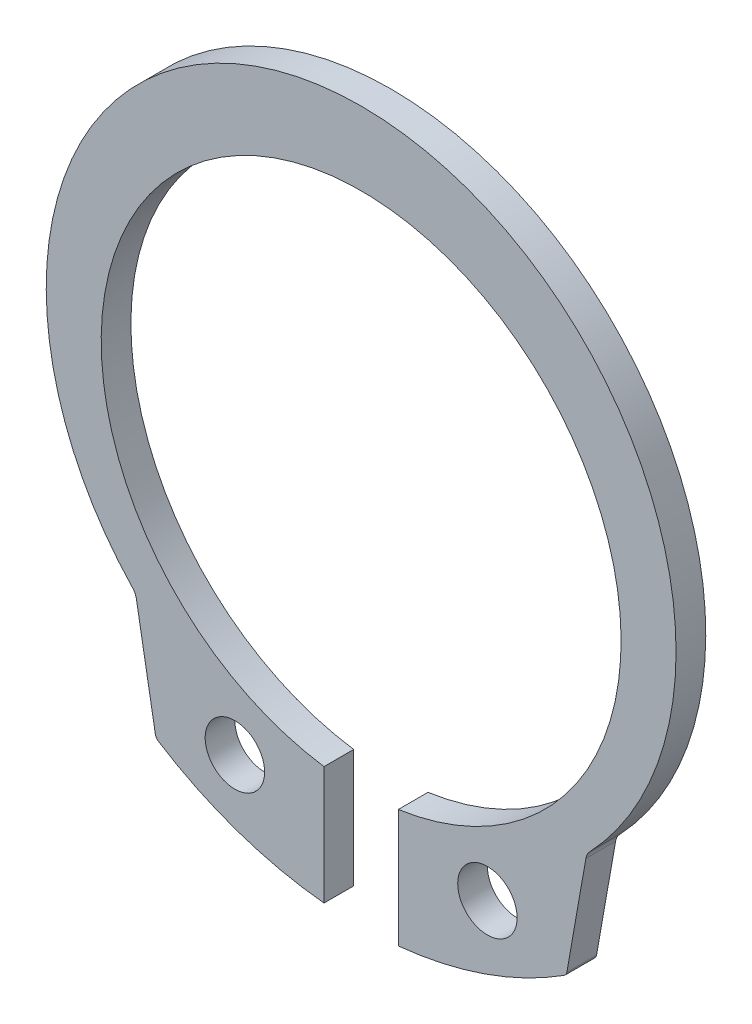
ISO-10303-21;
HEADER;
FILE_DESCRIPTION(('STEP AP214'),'2;1');
FILE_NAME('part.step','',(''),(''),'','','');
FILE_SCHEMA(('AUTOMOTIVE_DESIGN { 1 0 10303 214 1 1 1 1 }'));
ENDSEC;
DATA;
#1=APPLICATION_CONTEXT('core data for automotive mechanical design processes');
#2=APPLICATION_PROTOCOL_DEFINITION('international standard','automotive_design',2000,#1);
#3=PRODUCT_CONTEXT('',#1,'mechanical');
#4=PRODUCT('Part','Part','',(#3));
#5=PRODUCT_RELATED_PRODUCT_CATEGORY('part','',(#4));
#6=PRODUCT_DEFINITION_FORMATION('','',#4);
#7=PRODUCT_DEFINITION_CONTEXT('part definition',#1,'design');
#8=PRODUCT_DEFINITION('design','',#6,#7);
#9=PRODUCT_DEFINITION_SHAPE('','',#8);
#10=(LENGTH_UNIT() NAMED_UNIT(*) SI_UNIT(.MILLI.,.METRE.));
#11=(NAMED_UNIT(*) PLANE_ANGLE_UNIT() SI_UNIT($,.RADIAN.));
#12=(NAMED_UNIT(*) SI_UNIT($,.STERADIAN.) SOLID_ANGLE_UNIT());
#13=UNCERTAINTY_MEASURE_WITH_UNIT(LENGTH_MEASURE(1.E-05),#10,'distance_accuracy_value','');
#14=(GEOMETRIC_REPRESENTATION_CONTEXT(3) GLOBAL_UNCERTAINTY_ASSIGNED_CONTEXT((#13)) GLOBAL_UNIT_ASSIGNED_CONTEXT((#10,
#11,#12)) REPRESENTATION_CONTEXT('',''));
#15=CARTESIAN_POINT('',(0.,0.,0.));
#16=DIRECTION('',(0.,0.,1.));
#17=DIRECTION('',(1.,0.,0.));
#18=AXIS2_PLACEMENT_3D('',#15,#16,#17);
#19=CARTESIAN_POINT('',(0.,-0.62,-1.));
#20=DIRECTION('',(0.,0.,1.));
#21=DIRECTION('',(1.,0.,0.));
#22=AXIS2_PLACEMENT_3D('',#19,#20,#21);
#23=CYLINDRICAL_SURFACE('',#22,12.7);
#24=CARTESIAN_POINT('',(0.,-0.62,-1.));
#25=DIRECTION('',(0.,0.,1.));
#26=DIRECTION('',(-1.,0.,0.));
#27=AXIS2_PLACEMENT_3D('',#24,#25,#26);
#28=CIRCLE('',#27,12.7);
#29=CARTESIAN_POINT('',(1.25,-13.2583345421776,-1.));
#30=VERTEX_POINT('',#29);
#31=CARTESIAN_POINT('',(6.83381170142193,-11.3246259920424,-1.));
#32=VERTEX_POINT('',#31);
#33=EDGE_CURVE('E192',#30,#32,#28,.T.);
#34=ORIENTED_EDGE('',*,*,#33,.T.);
#35=DIRECTION('',(0.,0.,1.));
#36=VECTOR('',#35,1.);
#37=CARTESIAN_POINT('',(6.83381170142193,-11.3246259920423,-1.));
#38=LINE('',#37,#36);
#39=CARTESIAN_POINT('',(6.83381170142193,-11.3246259920424,0.));
#40=VERTEX_POINT('',#39);
#41=EDGE_CURVE('E214',#32,#40,#38,.T.);
#42=ORIENTED_EDGE('',*,*,#41,.T.);
#43=CARTESIAN_POINT('',(0.,-0.62,0.));
#44=DIRECTION('',(0.,0.,1.));
#45=DIRECTION('',(-1.,0.,0.));
#46=AXIS2_PLACEMENT_3D('',#43,#44,#45);
#47=CIRCLE('',#46,12.7);
#48=CARTESIAN_POINT('',(1.25,-13.2583345421776,0.));
#49=VERTEX_POINT('',#48);
#50=EDGE_CURVE('E169',#49,#40,#47,.T.);
#51=ORIENTED_EDGE('',*,*,#50,.F.);
#52=DIRECTION('',(0.,0.,1.));
#53=VECTOR('',#52,1.);
#54=CARTESIAN_POINT('',(1.25,-13.2583345421776,-1.));
#55=LINE('',#54,#53);
#56=EDGE_CURVE('E193',#30,#49,#55,.T.);
#57=ORIENTED_EDGE('',*,*,#56,.F.);
#58=EDGE_LOOP('',(#34,#42,#51,#57));
#59=FACE_BOUND('',#58,.T.);
#60=ADVANCED_FACE('F38',(#59),#23,.T.);
#61=CARTESIAN_POINT('',(1.25,-9.28025403784439,-1.));
#62=DIRECTION('',(-1.,0.,0.));
#63=DIRECTION('',(0.,-1.,0.));
#64=AXIS2_PLACEMENT_3D('',#61,#62,#63);
#65=PLANE('',#64);
#66=DIRECTION('',(0.,-1.,0.));
#67=VECTOR('',#66,1.);
#68=CARTESIAN_POINT('',(1.25,-9.28025403784439,0.));
#69=LINE('',#68,#67);
#70=CARTESIAN_POINT('',(1.25,-9.28025403784439,0.));
#71=VERTEX_POINT('',#70);
#72=EDGE_CURVE('E189',#71,#49,#69,.T.);
#73=ORIENTED_EDGE('',*,*,#72,.F.);
#74=DIRECTION('',(0.,0.,1.));
#75=VECTOR('',#74,1.);
#76=CARTESIAN_POINT('',(1.25,-9.28025403784439,-1.));
#77=LINE('',#76,#75);
#78=CARTESIAN_POINT('',(1.25,-9.28025403784439,-1.));
#79=VERTEX_POINT('',#78);
#80=EDGE_CURVE('E196',#79,#71,#77,.T.);
#81=ORIENTED_EDGE('',*,*,#80,.F.);
#82=DIRECTION('',(0.,-1.,0.));
#83=VECTOR('',#82,1.);
#84=CARTESIAN_POINT('',(1.25,-9.28025403784439,-1.));
#85=LINE('',#84,#83);
#86=EDGE_CURVE('E156',#79,#30,#85,.T.);
#87=ORIENTED_EDGE('',*,*,#86,.T.);
#88=ORIENTED_EDGE('',*,*,#56,.T.);
#89=EDGE_LOOP('',(#73,#81,#87,#88));
#90=FACE_BOUND('',#89,.T.);
#91=ADVANCED_FACE('F296',(#90),#65,.T.);
#92=CARTESIAN_POINT('',(0.,-0.62,-1.));
#93=DIRECTION('',(0.,0.,1.));
#94=DIRECTION('',(1.,0.,0.));
#95=AXIS2_PLACEMENT_3D('',#92,#93,#94);
#96=CYLINDRICAL_SURFACE('',#95,8.75);
#97=CARTESIAN_POINT('',(0.,-0.62,0.));
#98=DIRECTION('',(0.,0.,-1.));
#99=DIRECTION('',(1.,0.,0.));
#100=AXIS2_PLACEMENT_3D('',#97,#98,#99);
#101=CIRCLE('',#100,8.75);
#102=CARTESIAN_POINT('',(-1.25000000000001,-9.28025403784439,0.));
#103=VERTEX_POINT('',#102);
#104=EDGE_CURVE('E186',#103,#71,#101,.T.);
#105=ORIENTED_EDGE('',*,*,#104,.F.);
#106=DIRECTION('',(0.,0.,1.));
#107=VECTOR('',#106,1.);
#108=CARTESIAN_POINT('',(-1.25000000000001,-9.28025403784439,-1.));
#109=LINE('',#108,#107);
#110=CARTESIAN_POINT('',(-1.25000000000001,-9.28025403784439,-1.));
#111=VERTEX_POINT('',#110);
#112=EDGE_CURVE('E155',#111,#103,#109,.T.);
#113=ORIENTED_EDGE('',*,*,#112,.F.);
#114=CARTESIAN_POINT('',(0.,-0.62,-1.));
#115=DIRECTION('',(0.,0.,-1.));
#116=DIRECTION('',(1.,0.,0.));
#117=AXIS2_PLACEMENT_3D('',#114,#115,#116);
#118=CIRCLE('',#117,8.75);
#119=EDGE_CURVE('E162',#111,#79,#118,.T.);
#120=ORIENTED_EDGE('',*,*,#119,.T.);
#121=ORIENTED_EDGE('',*,*,#80,.T.);
#122=EDGE_LOOP('',(#105,#113,#120,#121));
#123=FACE_BOUND('',#122,.T.);
#124=ADVANCED_FACE('F299',(#123),#96,.F.);
#125=CARTESIAN_POINT('',(-1.25,-9.28025403784439,-1.));
#126=DIRECTION('',(1.,0.,0.));
#127=DIRECTION('',(0.,1.,0.));
#128=AXIS2_PLACEMENT_3D('',#125,#126,#127);
#129=PLANE('',#128);
#130=DIRECTION('',(0.,1.,0.));
#131=VECTOR('',#130,1.);
#132=CARTESIAN_POINT('',(-1.25,-9.28025403784439,0.));
#133=LINE('',#132,#131);
#134=CARTESIAN_POINT('',(-1.25,-13.2583345421776,0.));
#135=VERTEX_POINT('',#134);
#136=EDGE_CURVE('E154',#135,#103,#133,.T.);
#137=ORIENTED_EDGE('',*,*,#136,.F.);
#138=DIRECTION('',(0.,0.,1.));
#139=VECTOR('',#138,1.);
#140=CARTESIAN_POINT('',(-1.25,-13.2583345421776,-1.));
#141=LINE('',#140,#139);
#142=CARTESIAN_POINT('',(-1.25,-13.2583345421776,-1.));
#143=VERTEX_POINT('',#142);
#144=EDGE_CURVE('E138',#143,#135,#141,.T.);
#145=ORIENTED_EDGE('',*,*,#144,.F.);
#146=DIRECTION('',(0.,1.,0.));
#147=VECTOR('',#146,1.);
#148=CARTESIAN_POINT('',(-1.25,-9.28025403784439,-1.));
#149=LINE('',#148,#147);
#150=EDGE_CURVE('E147',#143,#111,#149,.T.);
#151=ORIENTED_EDGE('',*,*,#150,.T.);
#152=ORIENTED_EDGE('',*,*,#112,.T.);
#153=EDGE_LOOP('',(#137,#145,#151,#152));
#154=FACE_BOUND('',#153,.T.);
#155=ADVANCED_FACE('F152',(#154),#129,.T.);
#156=CARTESIAN_POINT('',(0.,-0.62,-1.));
#157=DIRECTION('',(0.,0.,1.));
#158=DIRECTION('',(1.,0.,0.));
#159=AXIS2_PLACEMENT_3D('',#156,#157,#158);
#160=CYLINDRICAL_SURFACE('',#159,12.7);
#161=CARTESIAN_POINT('',(0.,-0.62,0.));
#162=DIRECTION('',(0.,0.,1.));
#163=DIRECTION('',(1.,0.,0.));
#164=AXIS2_PLACEMENT_3D('',#161,#162,#163);
#165=CIRCLE('',#164,12.7);
#166=CARTESIAN_POINT('',(-6.83381170142193,-11.3246259920424,0.));
#167=VERTEX_POINT('',#166);
#168=EDGE_CURVE('E182',#167,#135,#165,.T.);
#169=ORIENTED_EDGE('',*,*,#168,.F.);
#170=DIRECTION('',(0.,0.,1.));
#171=VECTOR('',#170,1.);
#172=CARTESIAN_POINT('',(-6.83381170142193,-11.3246259920423,-1.));
#173=LINE('',#172,#171);
#174=CARTESIAN_POINT('',(-6.83381170142193,-11.3246259920424,-1.));
#175=VERTEX_POINT('',#174);
#176=EDGE_CURVE('E141',#167,#175,#173,.F.);
#177=ORIENTED_EDGE('',*,*,#176,.T.);
#178=CARTESIAN_POINT('',(0.,-0.62,-1.));
#179=DIRECTION('',(0.,0.,1.));
#180=DIRECTION('',(1.,0.,0.));
#181=AXIS2_PLACEMENT_3D('',#178,#179,#180);
#182=CIRCLE('',#181,12.7);
#183=EDGE_CURVE('E134',#175,#143,#182,.T.);
#184=ORIENTED_EDGE('',*,*,#183,.T.);
#185=ORIENTED_EDGE('',*,*,#144,.T.);
#186=EDGE_LOOP('',(#169,#177,#184,#185));
#187=FACE_BOUND('',#186,.T.);
#188=ADVANCED_FACE('F137',(#187),#160,.T.);
#189=CARTESIAN_POINT('',(-7.59203552672474,-7.3973641630617,-1.));
#190=DIRECTION('',(-0.984807753012208,-0.173648177666931,0.));
#191=DIRECTION('',(0.173648177666931,-0.984807753012208,0.));
#192=AXIS2_PLACEMENT_3D('',#189,#190,#191);
#193=PLANE('',#192);
#194=DIRECTION('',(0.173648177666931,-0.984807753012208,0.));
#195=VECTOR('',#194,1.);
#196=CARTESIAN_POINT('',(-7.59203552672474,-7.3973641630617,0.));
#197=LINE('',#196,#195);
#198=CARTESIAN_POINT('',(-7.56561540993803,-7.5472000910663,0.));
#199=VERTEX_POINT('',#198);
#200=CARTESIAN_POINT('',(-6.92315417011222,-11.1907788402995,0.));
#201=VERTEX_POINT('',#200);
#202=EDGE_CURVE('E179',#199,#201,#197,.T.);
#203=ORIENTED_EDGE('',*,*,#202,.F.);
#204=DIRECTION('',(0.,0.,-1.));
#205=VECTOR('',#204,1.);
#206=CARTESIAN_POINT('',(-7.56561540993803,-7.5472000910663,-1.));
#207=LINE('',#206,#205);
#208=CARTESIAN_POINT('',(-7.56561540993803,-7.5472000910663,-1.));
#209=VERTEX_POINT('',#208);
#210=EDGE_CURVE('E65',#199,#209,#207,.T.);
#211=ORIENTED_EDGE('',*,*,#210,.T.);
#212=DIRECTION('',(0.173648177666931,-0.984807753012208,0.));
#213=VECTOR('',#212,1.);
#214=CARTESIAN_POINT('',(-7.59203552672474,-7.3973641630617,-1.));
#215=LINE('',#214,#213);
#216=CARTESIAN_POINT('',(-6.92315417011222,-11.1907788402995,-1.));
#217=VERTEX_POINT('',#216);
#218=EDGE_CURVE('E148',#209,#217,#215,.T.);
#219=ORIENTED_EDGE('',*,*,#218,.T.);
#220=DIRECTION('',(0.,0.,1.));
#221=VECTOR('',#220,1.);
#222=CARTESIAN_POINT('',(-6.92315417011222,-11.1907788402995,-1.));
#223=LINE('',#222,#221);
#224=EDGE_CURVE('E195',#217,#201,#223,.T.);
#225=ORIENTED_EDGE('',*,*,#224,.T.);
#226=EDGE_LOOP('',(#203,#211,#219,#225));
#227=FACE_BOUND('',#226,.T.);
#228=ADVANCED_FACE('F365',(#227),#193,.T.);
#229=CARTESIAN_POINT('',(0.,0.,-1.));
#230=DIRECTION('',(0.,0.,1.));
#231=DIRECTION('',(1.,0.,0.));
#232=AXIS2_PLACEMENT_3D('',#229,#230,#231);
#233=CYLINDRICAL_SURFACE('',#232,10.6);
#234=CARTESIAN_POINT('',(0.,0.,0.));
#235=DIRECTION('',(0.,0.,1.));
#236=DIRECTION('',(1.,0.,0.));
#237=AXIS2_PLACEMENT_3D('',#234,#235,#236);
#238=CIRCLE('',#237,10.6);
#239=CARTESIAN_POINT('',(7.69504544471242,-7.29014921684122,0.));
#240=VERTEX_POINT('',#239);
#241=CARTESIAN_POINT('',(-7.69504544471242,-7.29014921684122,0.));
#242=VERTEX_POINT('',#241);
#243=EDGE_CURVE('E176',#240,#242,#238,.T.);
#244=ORIENTED_EDGE('',*,*,#243,.F.);
#245=DIRECTION('',(0.,0.,1.));
#246=VECTOR('',#245,1.);
#247=CARTESIAN_POINT('',(7.69504544471242,-7.29014921684122,-1.));
#248=LINE('',#247,#246);
#249=CARTESIAN_POINT('',(7.69504544471242,-7.29014921684122,-1.));
#250=VERTEX_POINT('',#249);
#251=EDGE_CURVE('E226',#240,#250,#248,.F.);
#252=ORIENTED_EDGE('',*,*,#251,.T.);
#253=CARTESIAN_POINT('',(0.,0.,-1.));
#254=DIRECTION('',(0.,0.,1.));
#255=DIRECTION('',(1.,0.,0.));
#256=AXIS2_PLACEMENT_3D('',#253,#254,#255);
#257=CIRCLE('',#256,10.6);
#258=CARTESIAN_POINT('',(-7.69504544471242,-7.29014921684122,-1.));
#259=VERTEX_POINT('',#258);
#260=EDGE_CURVE('E235',#250,#259,#257,.T.);
#261=ORIENTED_EDGE('',*,*,#260,.T.);
#262=DIRECTION('',(0.,0.,1.));
#263=VECTOR('',#262,1.);
#264=CARTESIAN_POINT('',(-7.69504544471242,-7.29014921684122,-1.));
#265=LINE('',#264,#263);
#266=EDGE_CURVE('E222',#259,#242,#265,.T.);
#267=ORIENTED_EDGE('',*,*,#266,.T.);
#268=EDGE_LOOP('',(#244,#252,#261,#267));
#269=FACE_BOUND('',#268,.T.);
#270=ADVANCED_FACE('F275',(#269),#233,.T.);
#271=CARTESIAN_POINT('',(7.59203552672474,-7.3973641630617,-1.));
#272=DIRECTION('',(0.984807753012208,-0.173648177666931,0.));
#273=DIRECTION('',(0.173648177666931,0.984807753012208,0.));
#274=AXIS2_PLACEMENT_3D('',#271,#272,#273);
#275=PLANE('',#274);
#276=DIRECTION('',(0.173648177666931,0.984807753012208,0.));
#277=VECTOR('',#276,1.);
#278=CARTESIAN_POINT('',(7.59203552672474,-7.3973641630617,-1.));
#279=LINE('',#278,#277);
#280=CARTESIAN_POINT('',(6.92315417011222,-11.1907788402995,-1.));
#281=VERTEX_POINT('',#280);
#282=CARTESIAN_POINT('',(7.56561540993803,-7.5472000910663,-1.));
#283=VERTEX_POINT('',#282);
#284=EDGE_CURVE('E237',#281,#283,#279,.T.);
#285=ORIENTED_EDGE('',*,*,#284,.T.);
#286=DIRECTION('',(0.,0.,-1.));
#287=VECTOR('',#286,1.);
#288=CARTESIAN_POINT('',(7.56561540993803,-7.5472000910663,0.));
#289=LINE('',#288,#287);
#290=CARTESIAN_POINT('',(7.56561540993803,-7.5472000910663,0.));
#291=VERTEX_POINT('',#290);
#292=EDGE_CURVE('E219',#283,#291,#289,.F.);
#293=ORIENTED_EDGE('',*,*,#292,.T.);
#294=DIRECTION('',(0.173648177666931,0.984807753012208,0.));
#295=VECTOR('',#294,1.);
#296=CARTESIAN_POINT('',(7.59203552672474,-7.3973641630617,0.));
#297=LINE('',#296,#295);
#298=CARTESIAN_POINT('',(6.92315417011222,-11.1907788402995,0.));
#299=VERTEX_POINT('',#298);
#300=EDGE_CURVE('E172',#299,#291,#297,.T.);
#301=ORIENTED_EDGE('',*,*,#300,.F.);
#302=DIRECTION('',(0.,0.,1.));
#303=VECTOR('',#302,1.);
#304=CARTESIAN_POINT('',(6.92315417011222,-11.1907788402995,-1.));
#305=LINE('',#304,#303);
#306=EDGE_CURVE('E217',#299,#281,#305,.F.);
#307=ORIENTED_EDGE('',*,*,#306,.T.);
#308=EDGE_LOOP('',(#285,#293,#301,#307));
#309=FACE_BOUND('',#308,.T.);
#310=ADVANCED_FACE('F285',(#309),#275,.T.);
#311=CARTESIAN_POINT('',(0.,-0.62,-1.));
#312=DIRECTION('',(0.,0.,-1.));
#313=DIRECTION('',(-1.,0.,0.));
#314=AXIS2_PLACEMENT_3D('',#311,#312,#313);
#315=PLANE('',#314);
#316=CARTESIAN_POINT('',(4.25,-10.4397505059956,-1.));
#317=DIRECTION('',(0.,0.,1.));
#318=DIRECTION('',(-1.,0.,0.));
#319=AXIS2_PLACEMENT_3D('',#316,#317,#318);
#320=CIRCLE('',#319,1.);
#321=CARTESIAN_POINT('',(3.25,-10.4397505059956,-1.));
#322=VERTEX_POINT('',#321);
#323=EDGE_CURVE('E248',#322,#322,#320,.T.);
#324=ORIENTED_EDGE('',*,*,#323,.T.);
#325=EDGE_LOOP('',(#324));
#326=FACE_BOUND('',#325,.T.);
#327=CARTESIAN_POINT('',(-4.25,-10.4397505059956,-1.));
#328=DIRECTION('',(0.,0.,1.));
#329=DIRECTION('',(1.,0.,0.));
#330=AXIS2_PLACEMENT_3D('',#327,#328,#329);
#331=CIRCLE('',#330,1.);
#332=CARTESIAN_POINT('',(-3.25,-10.4397505059956,-1.));
#333=VERTEX_POINT('',#332);
#334=EDGE_CURVE('E173',#333,#333,#331,.T.);
#335=ORIENTED_EDGE('',*,*,#334,.T.);
#336=EDGE_LOOP('',(#335));
#337=FACE_BOUND('',#336,.T.);
#338=ORIENTED_EDGE('',*,*,#183,.F.);
#339=CARTESIAN_POINT('',(-6.72619261950978,-11.1560492047661,-1.));
#340=DIRECTION('',(0.,0.,-1.));
#341=DIRECTION('',(-1.,0.,0.));
#342=AXIS2_PLACEMENT_3D('',#339,#340,#341);
#343=CIRCLE('',#342,0.2);
#344=EDGE_CURVE('E211',#175,#217,#343,.T.);
#345=ORIENTED_EDGE('',*,*,#344,.T.);
#346=ORIENTED_EDGE('',*,*,#218,.F.);
#347=CARTESIAN_POINT('',(-8.05801928644414,-7.63402417989977,-1.));
#348=DIRECTION('',(0.,0.,-1.));
#349=DIRECTION('',(-1.,0.,0.));
#350=AXIS2_PLACEMENT_3D('',#347,#348,#349);
#351=CIRCLE('',#350,0.5);
#352=EDGE_CURVE('E11',#209,#259,#351,.F.);
#353=ORIENTED_EDGE('',*,*,#352,.T.);
#354=ORIENTED_EDGE('',*,*,#260,.F.);
#355=CARTESIAN_POINT('',(8.05801928644414,-7.63402417989977,-1.));
#356=DIRECTION('',(0.,0.,-1.));
#357=DIRECTION('',(-1.,0.,0.));
#358=AXIS2_PLACEMENT_3D('',#355,#356,#357);
#359=CIRCLE('',#358,0.5);
#360=EDGE_CURVE('E232',#250,#283,#359,.F.);
#361=ORIENTED_EDGE('',*,*,#360,.T.);
#362=ORIENTED_EDGE('',*,*,#284,.F.);
#363=CARTESIAN_POINT('',(6.72619261950978,-11.1560492047661,-1.));
#364=DIRECTION('',(0.,0.,-1.));
#365=DIRECTION('',(-1.,0.,0.));
#366=AXIS2_PLACEMENT_3D('',#363,#364,#365);
#367=CIRCLE('',#366,0.2);
#368=EDGE_CURVE('E209',#281,#32,#367,.T.);
#369=ORIENTED_EDGE('',*,*,#368,.T.);
#370=ORIENTED_EDGE('',*,*,#33,.F.);
#371=ORIENTED_EDGE('',*,*,#86,.F.);
#372=ORIENTED_EDGE('',*,*,#119,.F.);
#373=ORIENTED_EDGE('',*,*,#150,.F.);
#374=EDGE_LOOP('',(#338,#345,#346,#353,#354,#361,#362,#369,#370,#371,#372,#373));
#375=FACE_BOUND('',#374,.T.);
#376=ADVANCED_FACE('F159',(#326,#337,#375),#315,.T.);
#377=CARTESIAN_POINT('',(0.,-0.62,0.));
#378=DIRECTION('',(0.,0.,-1.));
#379=DIRECTION('',(-1.,0.,0.));
#380=AXIS2_PLACEMENT_3D('',#377,#378,#379);
#381=PLANE('',#380);
#382=CARTESIAN_POINT('',(4.25,-10.4397505059956,0.));
#383=DIRECTION('',(0.,0.,1.));
#384=DIRECTION('',(-1.,0.,0.));
#385=AXIS2_PLACEMENT_3D('',#382,#383,#384);
#386=CIRCLE('',#385,1.);
#387=CARTESIAN_POINT('',(3.25,-10.4397505059956,0.));
#388=VERTEX_POINT('',#387);
#389=EDGE_CURVE('E251',#388,#388,#386,.T.);
#390=ORIENTED_EDGE('',*,*,#389,.F.);
#391=EDGE_LOOP('',(#390));
#392=FACE_BOUND('',#391,.T.);
#393=CARTESIAN_POINT('',(-4.25,-10.4397505059956,0.));
#394=DIRECTION('',(0.,0.,1.));
#395=DIRECTION('',(1.,0.,0.));
#396=AXIS2_PLACEMENT_3D('',#393,#394,#395);
#397=CIRCLE('',#396,1.);
#398=CARTESIAN_POINT('',(-3.25,-10.4397505059956,0.));
#399=VERTEX_POINT('',#398);
#400=EDGE_CURVE('E245',#399,#399,#397,.T.);
#401=ORIENTED_EDGE('',*,*,#400,.F.);
#402=EDGE_LOOP('',(#401));
#403=FACE_BOUND('',#402,.T.);
#404=ORIENTED_EDGE('',*,*,#243,.T.);
#405=CARTESIAN_POINT('',(-8.05801928644414,-7.63402417989977,0.));
#406=DIRECTION('',(0.,0.,-1.));
#407=DIRECTION('',(-1.,0.,0.));
#408=AXIS2_PLACEMENT_3D('',#405,#406,#407);
#409=CIRCLE('',#408,0.5);
#410=EDGE_CURVE('E47',#242,#199,#409,.T.);
#411=ORIENTED_EDGE('',*,*,#410,.T.);
#412=ORIENTED_EDGE('',*,*,#202,.T.);
#413=CARTESIAN_POINT('',(-6.72619261950978,-11.1560492047661,0.));
#414=DIRECTION('',(0.,0.,-1.));
#415=DIRECTION('',(-1.,0.,0.));
#416=AXIS2_PLACEMENT_3D('',#413,#414,#415);
#417=CIRCLE('',#416,0.2);
#418=EDGE_CURVE('E204',#201,#167,#417,.F.);
#419=ORIENTED_EDGE('',*,*,#418,.T.);
#420=ORIENTED_EDGE('',*,*,#168,.T.);
#421=ORIENTED_EDGE('',*,*,#136,.T.);
#422=ORIENTED_EDGE('',*,*,#104,.T.);
#423=ORIENTED_EDGE('',*,*,#72,.T.);
#424=ORIENTED_EDGE('',*,*,#50,.T.);
#425=CARTESIAN_POINT('',(6.72619261950978,-11.1560492047661,0.));
#426=DIRECTION('',(0.,0.,-1.));
#427=DIRECTION('',(-1.,0.,0.));
#428=AXIS2_PLACEMENT_3D('',#425,#426,#427);
#429=CIRCLE('',#428,0.2);
#430=EDGE_CURVE('E202',#40,#299,#429,.F.);
#431=ORIENTED_EDGE('',*,*,#430,.T.);
#432=ORIENTED_EDGE('',*,*,#300,.T.);
#433=CARTESIAN_POINT('',(8.05801928644414,-7.63402417989977,0.));
#434=DIRECTION('',(0.,0.,-1.));
#435=DIRECTION('',(-1.,0.,0.));
#436=AXIS2_PLACEMENT_3D('',#433,#434,#435);
#437=CIRCLE('',#436,0.5);
#438=EDGE_CURVE('E230',#291,#240,#437,.T.);
#439=ORIENTED_EDGE('',*,*,#438,.T.);
#440=EDGE_LOOP('',(#404,#411,#412,#419,#420,#421,#422,#423,#424,#431,#432,#439));
#441=FACE_BOUND('',#440,.T.);
#442=ADVANCED_FACE('F267',(#392,#403,#441),#381,.F.);
#443=CARTESIAN_POINT('',(-4.25,-10.4397505059956,-1.));
#444=DIRECTION('',(0.,0.,1.));
#445=DIRECTION('',(1.,0.,0.));
#446=AXIS2_PLACEMENT_3D('',#443,#444,#445);
#447=CYLINDRICAL_SURFACE('',#446,1.);
#448=ORIENTED_EDGE('',*,*,#334,.F.);
#449=EDGE_LOOP('',(#448));
#450=FACE_BOUND('',#449,.T.);
#451=ORIENTED_EDGE('',*,*,#400,.T.);
#452=EDGE_LOOP('',(#451));
#453=FACE_BOUND('',#452,.T.);
#454=ADVANCED_FACE('F263',(#450,#453),#447,.F.);
#455=CARTESIAN_POINT('',(4.25,-10.4397505059956,-1.));
#456=DIRECTION('',(0.,0.,1.));
#457=DIRECTION('',(1.,0.,0.));
#458=AXIS2_PLACEMENT_3D('',#455,#456,#457);
#459=CYLINDRICAL_SURFACE('',#458,1.);
#460=ORIENTED_EDGE('',*,*,#323,.F.);
#461=EDGE_LOOP('',(#460));
#462=FACE_BOUND('',#461,.T.);
#463=ORIENTED_EDGE('',*,*,#389,.T.);
#464=EDGE_LOOP('',(#463));
#465=FACE_BOUND('',#464,.T.);
#466=ADVANCED_FACE('F259',(#462,#465),#459,.F.);
#467=CARTESIAN_POINT('',(-6.72619261950978,-11.1560492047661,-1.));
#468=DIRECTION('',(0.,0.,1.));
#469=DIRECTION('',(1.,0.,0.));
#470=AXIS2_PLACEMENT_3D('',#467,#468,#469);
#471=CYLINDRICAL_SURFACE('',#470,0.2);
#472=ORIENTED_EDGE('',*,*,#344,.F.);
#473=ORIENTED_EDGE('',*,*,#176,.F.);
#474=ORIENTED_EDGE('',*,*,#418,.F.);
#475=ORIENTED_EDGE('',*,*,#224,.F.);
#476=EDGE_LOOP('',(#472,#473,#474,#475));
#477=FACE_BOUND('',#476,.T.);
#478=ADVANCED_FACE('F262',(#477),#471,.T.);
#479=CARTESIAN_POINT('',(6.72619261950978,-11.1560492047661,-1.));
#480=DIRECTION('',(0.,0.,1.));
#481=DIRECTION('',(1.,0.,0.));
#482=AXIS2_PLACEMENT_3D('',#479,#480,#481);
#483=CYLINDRICAL_SURFACE('',#482,0.2);
#484=ORIENTED_EDGE('',*,*,#368,.F.);
#485=ORIENTED_EDGE('',*,*,#306,.F.);
#486=ORIENTED_EDGE('',*,*,#430,.F.);
#487=ORIENTED_EDGE('',*,*,#41,.F.);
#488=EDGE_LOOP('',(#484,#485,#486,#487));
#489=FACE_BOUND('',#488,.T.);
#490=ADVANCED_FACE('F289',(#489),#483,.T.);
#491=CARTESIAN_POINT('',(8.05801928644414,-7.63402417989977,-1.));
#492=DIRECTION('',(0.,0.,1.));
#493=DIRECTION('',(1.,0.,0.));
#494=AXIS2_PLACEMENT_3D('',#491,#492,#493);
#495=CYLINDRICAL_SURFACE('',#494,0.5);
#496=ORIENTED_EDGE('',*,*,#360,.F.);
#497=ORIENTED_EDGE('',*,*,#251,.F.);
#498=ORIENTED_EDGE('',*,*,#438,.F.);
#499=ORIENTED_EDGE('',*,*,#292,.F.);
#500=EDGE_LOOP('',(#496,#497,#498,#499));
#501=FACE_BOUND('',#500,.T.);
#502=ADVANCED_FACE('F280',(#501),#495,.F.);
#503=CARTESIAN_POINT('',(-8.05801928644414,-7.63402417989977,-1.));
#504=DIRECTION('',(0.,0.,1.));
#505=DIRECTION('',(1.,0.,0.));
#506=AXIS2_PLACEMENT_3D('',#503,#504,#505);
#507=CYLINDRICAL_SURFACE('',#506,0.5);
#508=ORIENTED_EDGE('',*,*,#352,.F.);
#509=ORIENTED_EDGE('',*,*,#210,.F.);
#510=ORIENTED_EDGE('',*,*,#410,.F.);
#511=ORIENTED_EDGE('',*,*,#266,.F.);
#512=EDGE_LOOP('',(#508,#509,#510,#511));
#513=FACE_BOUND('',#512,.T.);
#514=ADVANCED_FACE('F40',(#513),#507,.F.);
#515=CLOSED_SHELL('',(#60,#91,#124,#155,#188,#228,#270,#310,#376,#442,#454,#466,#478,#490,#502,#514));
#516=MANIFOLD_SOLID_BREP('B2',#515);
#517=ADVANCED_BREP_SHAPE_REPRESENTATION('',(#18,#516),#14);
#518=SHAPE_DEFINITION_REPRESENTATION(#9,#517);
ENDSEC;
END-ISO-10303-21;
